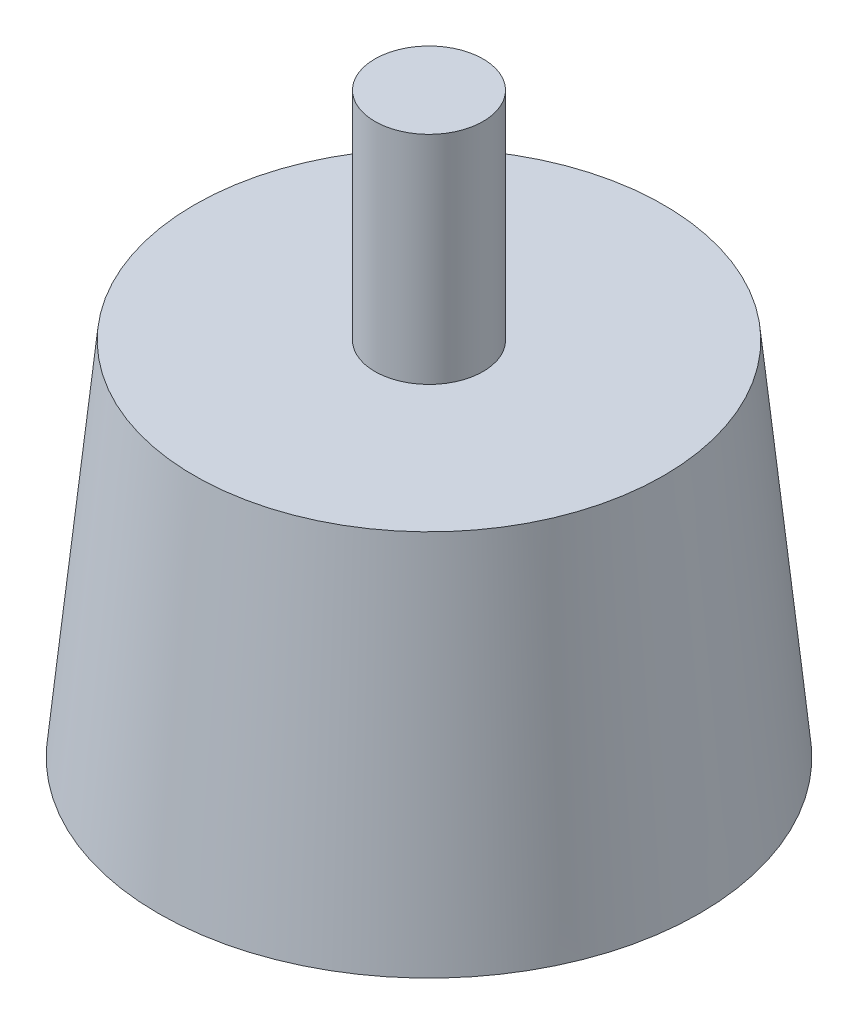
ISO-10303-21;
HEADER;
FILE_DESCRIPTION(('STEP AP214'),'2;1');
FILE_NAME('part.step','',(''),(''),'','','');
FILE_SCHEMA(('AUTOMOTIVE_DESIGN { 1 0 10303 214 1 1 1 1 }'));
ENDSEC;
DATA;
#1=APPLICATION_CONTEXT('core data for automotive mechanical design processes');
#2=APPLICATION_PROTOCOL_DEFINITION('international standard','automotive_design',2000,#1);
#3=PRODUCT_CONTEXT('',#1,'mechanical');
#4=PRODUCT('Part','Part','',(#3));
#5=PRODUCT_RELATED_PRODUCT_CATEGORY('part','',(#4));
#6=PRODUCT_DEFINITION_FORMATION('','',#4);
#7=PRODUCT_DEFINITION_CONTEXT('part definition',#1,'design');
#8=PRODUCT_DEFINITION('design','',#6,#7);
#9=PRODUCT_DEFINITION_SHAPE('','',#8);
#10=(LENGTH_UNIT() NAMED_UNIT(*) SI_UNIT(.MILLI.,.METRE.));
#11=(NAMED_UNIT(*) PLANE_ANGLE_UNIT() SI_UNIT($,.RADIAN.));
#12=(NAMED_UNIT(*) SI_UNIT($,.STERADIAN.) SOLID_ANGLE_UNIT());
#13=UNCERTAINTY_MEASURE_WITH_UNIT(LENGTH_MEASURE(1.E-05),#10,'distance_accuracy_value','');
#14=(GEOMETRIC_REPRESENTATION_CONTEXT(3) GLOBAL_UNCERTAINTY_ASSIGNED_CONTEXT((#13)) GLOBAL_UNIT_ASSIGNED_CONTEXT((#10,
#11,#12)) REPRESENTATION_CONTEXT('',''));
#15=CARTESIAN_POINT('',(0.,0.,0.));
#16=DIRECTION('',(0.,0.,1.));
#17=DIRECTION('',(1.,0.,0.));
#18=AXIS2_PLACEMENT_3D('',#15,#16,#17);
#19=CARTESIAN_POINT('',(0.,0.,0.));
#20=DIRECTION('',(0.,1.,0.));
#21=DIRECTION('',(-1.,0.,0.));
#22=AXIS2_PLACEMENT_3D('',#19,#20,#21);
#23=PLANE('',#22);
#24=CARTESIAN_POINT('',(0.,0.,0.));
#25=DIRECTION('',(0.,1.,0.));
#26=DIRECTION('',(-1.,0.,0.));
#27=AXIS2_PLACEMENT_3D('',#24,#25,#26);
#28=CIRCLE('',#27,15.);
#29=CARTESIAN_POINT('',(-15.,0.,0.));
#30=VERTEX_POINT('',#29);
#31=EDGE_CURVE('E10',#30,#30,#28,.T.);
#32=ORIENTED_EDGE('',*,*,#31,.F.);
#33=EDGE_LOOP('',(#32));
#34=FACE_BOUND('',#33,.T.);
#35=ADVANCED_FACE('F43',(#34),#23,.F.);
#36=CARTESIAN_POINT('',(0.,0.,0.));
#37=DIRECTION('',(0.,-1.,0.));
#38=DIRECTION('',(1.,0.,0.));
#39=AXIS2_PLACEMENT_3D('',#36,#37,#38);
#40=CONICAL_SURFACE('',#39,15.,0.099668652491162);
#41=CARTESIAN_POINT('',(0.,20.,0.));
#42=DIRECTION('',(0.,1.,0.));
#43=DIRECTION('',(-1.,0.,0.));
#44=AXIS2_PLACEMENT_3D('',#41,#42,#43);
#45=CIRCLE('',#44,13.);
#46=CARTESIAN_POINT('',(-13.,20.,0.));
#47=VERTEX_POINT('',#46);
#48=EDGE_CURVE('E49',#47,#47,#45,.T.);
#49=ORIENTED_EDGE('',*,*,#48,.F.);
#50=EDGE_LOOP('',(#49));
#51=FACE_BOUND('',#50,.T.);
#52=ORIENTED_EDGE('',*,*,#31,.T.);
#53=EDGE_LOOP('',(#52));
#54=FACE_BOUND('',#53,.T.);
#55=ADVANCED_FACE('F73',(#51,#54),#40,.T.);
#56=CARTESIAN_POINT('',(13.,20.,0.));
#57=DIRECTION('',(0.,-1.,0.));
#58=DIRECTION('',(1.,0.,0.));
#59=AXIS2_PLACEMENT_3D('',#56,#57,#58);
#60=PLANE('',#59);
#61=CARTESIAN_POINT('',(0.,20.,0.));
#62=DIRECTION('',(0.,1.,0.));
#63=DIRECTION('',(-1.,0.,0.));
#64=AXIS2_PLACEMENT_3D('',#61,#62,#63);
#65=CIRCLE('',#64,3.);
#66=CARTESIAN_POINT('',(-3.,20.,0.));
#67=VERTEX_POINT('',#66);
#68=EDGE_CURVE('E53',#67,#67,#65,.T.);
#69=ORIENTED_EDGE('',*,*,#68,.F.);
#70=EDGE_LOOP('',(#69));
#71=FACE_BOUND('',#70,.T.);
#72=ORIENTED_EDGE('',*,*,#48,.T.);
#73=EDGE_LOOP('',(#72));
#74=FACE_BOUND('',#73,.T.);
#75=ADVANCED_FACE('F68',(#71,#74),#60,.F.);
#76=CARTESIAN_POINT('',(0.,32.,0.));
#77=DIRECTION('',(0.,1.,0.));
#78=DIRECTION('',(-1.,0.,0.));
#79=AXIS2_PLACEMENT_3D('',#76,#77,#78);
#80=CYLINDRICAL_SURFACE('',#79,3.);
#81=CARTESIAN_POINT('',(0.,32.,0.));
#82=DIRECTION('',(0.,1.,0.));
#83=DIRECTION('',(-1.,0.,0.));
#84=AXIS2_PLACEMENT_3D('',#81,#82,#83);
#85=CIRCLE('',#84,3.);
#86=CARTESIAN_POINT('',(-3.,32.,0.));
#87=VERTEX_POINT('',#86);
#88=EDGE_CURVE('E57',#87,#87,#85,.T.);
#89=ORIENTED_EDGE('',*,*,#88,.F.);
#90=EDGE_LOOP('',(#89));
#91=FACE_BOUND('',#90,.T.);
#92=ORIENTED_EDGE('',*,*,#68,.T.);
#93=EDGE_LOOP('',(#92));
#94=FACE_BOUND('',#93,.T.);
#95=ADVANCED_FACE('F65',(#91,#94),#80,.T.);
#96=CARTESIAN_POINT('',(3.,32.,0.));
#97=DIRECTION('',(0.,-1.,0.));
#98=DIRECTION('',(1.,0.,0.));
#99=AXIS2_PLACEMENT_3D('',#96,#97,#98);
#100=PLANE('',#99);
#101=ORIENTED_EDGE('',*,*,#88,.T.);
#102=EDGE_LOOP('',(#101));
#103=FACE_BOUND('',#102,.T.);
#104=ADVANCED_FACE('F63',(#103),#100,.F.);
#105=CLOSED_SHELL('',(#35,#55,#75,#95,#104));
#106=MANIFOLD_SOLID_BREP('B2',#105);
#107=ADVANCED_BREP_SHAPE_REPRESENTATION('',(#18,#106),#14);
#108=SHAPE_DEFINITION_REPRESENTATION(#9,#107);
ENDSEC;
END-ISO-10303-21;
